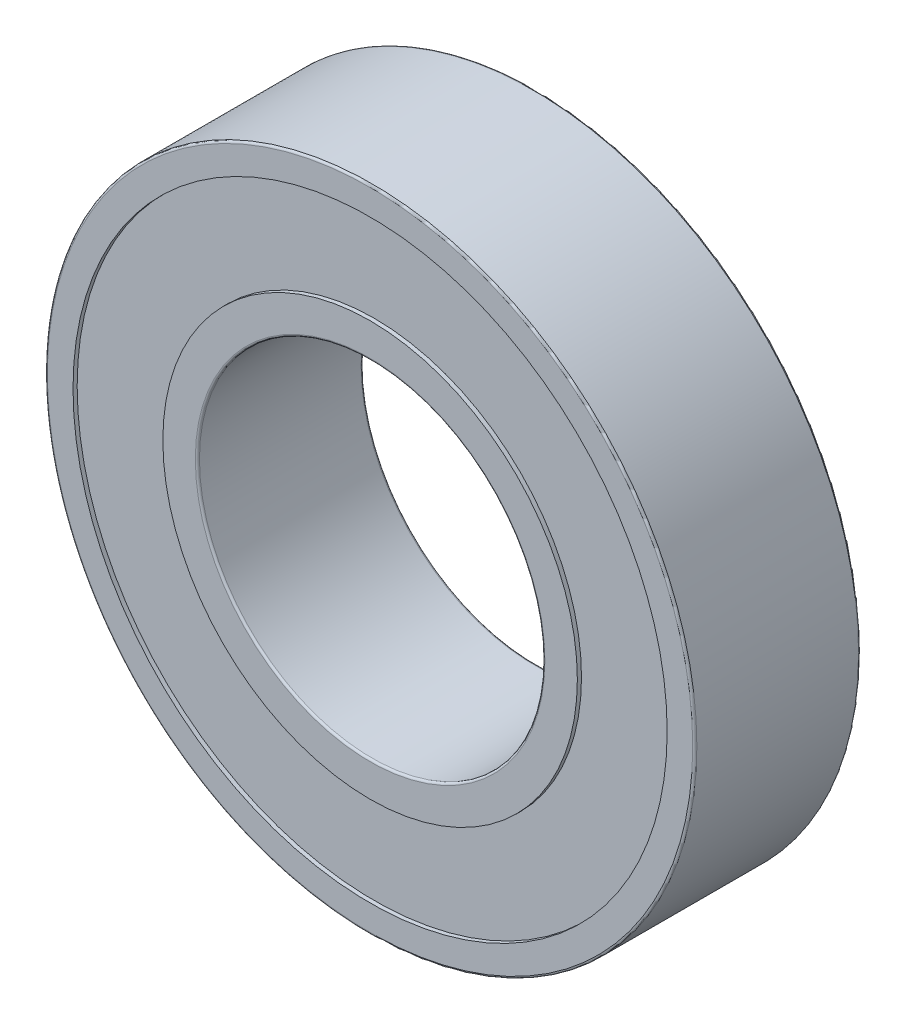
ISO-10303-21;
HEADER;
FILE_DESCRIPTION(('STEP AP214'),'2;1');
FILE_NAME('part.step','',(''),(''),'','','');
FILE_SCHEMA(('AUTOMOTIVE_DESIGN { 1 0 10303 214 1 1 1 1 }'));
ENDSEC;
DATA;
#1=APPLICATION_CONTEXT('core data for automotive mechanical design processes');
#2=APPLICATION_PROTOCOL_DEFINITION('international standard','automotive_design',2000,#1);
#3=PRODUCT_CONTEXT('',#1,'mechanical');
#4=PRODUCT('Part','Part','',(#3));
#5=PRODUCT_RELATED_PRODUCT_CATEGORY('part','',(#4));
#6=PRODUCT_DEFINITION_FORMATION('','',#4);
#7=PRODUCT_DEFINITION_CONTEXT('part definition',#1,'design');
#8=PRODUCT_DEFINITION('design','',#6,#7);
#9=PRODUCT_DEFINITION_SHAPE('','',#8);
#10=(LENGTH_UNIT() NAMED_UNIT(*) SI_UNIT(.MILLI.,.METRE.));
#11=(NAMED_UNIT(*) PLANE_ANGLE_UNIT() SI_UNIT($,.RADIAN.));
#12=(NAMED_UNIT(*) SI_UNIT($,.STERADIAN.) SOLID_ANGLE_UNIT());
#13=UNCERTAINTY_MEASURE_WITH_UNIT(LENGTH_MEASURE(1.E-05),#10,'distance_accuracy_value','');
#14=(GEOMETRIC_REPRESENTATION_CONTEXT(3) GLOBAL_UNCERTAINTY_ASSIGNED_CONTEXT((#13)) GLOBAL_UNIT_ASSIGNED_CONTEXT((#10,
#11,#12)) REPRESENTATION_CONTEXT('',''));
#15=CARTESIAN_POINT('',(0.,0.,0.));
#16=DIRECTION('',(0.,0.,1.));
#17=DIRECTION('',(1.,0.,0.));
#18=AXIS2_PLACEMENT_3D('',#15,#16,#17);
#19=CARTESIAN_POINT('',(0.,0.,0.));
#20=DIRECTION('',(0.,0.,1.));
#21=DIRECTION('',(1.,0.,0.));
#22=AXIS2_PLACEMENT_3D('',#19,#20,#21);
#23=PLANE('',#22);
#24=CARTESIAN_POINT('',(0.,0.,0.));
#25=DIRECTION('',(0.,0.,1.));
#26=DIRECTION('',(1.,0.,0.));
#27=AXIS2_PLACEMENT_3D('',#24,#25,#26);
#28=CIRCLE('',#27,12.65);
#29=CARTESIAN_POINT('',(12.65,0.,0.));
#30=VERTEX_POINT('',#29);
#31=EDGE_CURVE('E64',#30,#30,#28,.T.);
#32=ORIENTED_EDGE('',*,*,#31,.T.);
#33=EDGE_LOOP('',(#32));
#34=FACE_BOUND('',#33,.T.);
#35=CARTESIAN_POINT('',(0.,0.,0.));
#36=DIRECTION('',(0.,0.,1.));
#37=DIRECTION('',(1.,0.,0.));
#38=AXIS2_PLACEMENT_3D('',#35,#36,#37);
#39=CIRCLE('',#38,15.);
#40=CARTESIAN_POINT('',(15.,0.,0.));
#41=VERTEX_POINT('',#40);
#42=EDGE_CURVE('E86',#41,#41,#39,.T.);
#43=ORIENTED_EDGE('',*,*,#42,.F.);
#44=EDGE_LOOP('',(#43));
#45=FACE_BOUND('',#44,.T.);
#46=ADVANCED_FACE('F35',(#34,#45),#23,.F.);
#47=CARTESIAN_POINT('',(0.,0.,12.));
#48=DIRECTION('',(0.,0.,1.));
#49=DIRECTION('',(1.,0.,0.));
#50=AXIS2_PLACEMENT_3D('',#47,#48,#49);
#51=PLANE('',#50);
#52=CARTESIAN_POINT('',(0.,0.,12.));
#53=DIRECTION('',(0.,0.,1.));
#54=DIRECTION('',(1.,0.,0.));
#55=AXIS2_PLACEMENT_3D('',#52,#53,#54);
#56=CIRCLE('',#55,12.65);
#57=CARTESIAN_POINT('',(12.65,0.,12.));
#58=VERTEX_POINT('',#57);
#59=EDGE_CURVE('E42',#58,#58,#56,.F.);
#60=ORIENTED_EDGE('',*,*,#59,.T.);
#61=EDGE_LOOP('',(#60));
#62=FACE_BOUND('',#61,.T.);
#63=CARTESIAN_POINT('',(0.,0.,12.));
#64=DIRECTION('',(0.,0.,1.));
#65=DIRECTION('',(1.,0.,0.));
#66=AXIS2_PLACEMENT_3D('',#63,#64,#65);
#67=CIRCLE('',#66,15.);
#68=CARTESIAN_POINT('',(15.,0.,12.));
#69=VERTEX_POINT('',#68);
#70=EDGE_CURVE('E74',#69,#69,#67,.T.);
#71=ORIENTED_EDGE('',*,*,#70,.T.);
#72=EDGE_LOOP('',(#71));
#73=FACE_BOUND('',#72,.T.);
#74=ADVANCED_FACE('F103',(#62,#73),#51,.T.);
#75=CARTESIAN_POINT('',(0.,0.,12.));
#76=DIRECTION('',(0.,0.,1.));
#77=DIRECTION('',(1.,0.,0.));
#78=AXIS2_PLACEMENT_3D('',#75,#76,#77);
#79=CIRCLE('',#78,23.35);
#80=CARTESIAN_POINT('',(23.35,0.,12.));
#81=VERTEX_POINT('',#80);
#82=EDGE_CURVE('E10',#81,#81,#79,.T.);
#83=ORIENTED_EDGE('',*,*,#82,.T.);
#84=EDGE_LOOP('',(#83));
#85=FACE_BOUND('',#84,.T.);
#86=CARTESIAN_POINT('',(0.,0.,12.));
#87=DIRECTION('',(0.,0.,1.));
#88=DIRECTION('',(1.,0.,0.));
#89=AXIS2_PLACEMENT_3D('',#86,#87,#88);
#90=CIRCLE('',#89,21.5);
#91=CARTESIAN_POINT('',(21.5,0.,12.));
#92=VERTEX_POINT('',#91);
#93=EDGE_CURVE('E68',#92,#92,#90,.T.);
#94=ORIENTED_EDGE('',*,*,#93,.F.);
#95=EDGE_LOOP('',(#94));
#96=FACE_BOUND('',#95,.T.);
#97=ADVANCED_FACE('F110',(#85,#96),#51,.T.);
#98=CARTESIAN_POINT('',(0.,0.,0.));
#99=DIRECTION('',(0.,0.,1.));
#100=DIRECTION('',(1.,0.,0.));
#101=AXIS2_PLACEMENT_3D('',#98,#99,#100);
#102=CIRCLE('',#101,23.35);
#103=CARTESIAN_POINT('',(23.35,0.,0.));
#104=VERTEX_POINT('',#103);
#105=EDGE_CURVE('E46',#104,#104,#102,.F.);
#106=ORIENTED_EDGE('',*,*,#105,.T.);
#107=EDGE_LOOP('',(#106));
#108=FACE_BOUND('',#107,.T.);
#109=CARTESIAN_POINT('',(0.,0.,0.));
#110=DIRECTION('',(0.,0.,1.));
#111=DIRECTION('',(1.,0.,0.));
#112=AXIS2_PLACEMENT_3D('',#109,#110,#111);
#113=CIRCLE('',#112,21.5);
#114=CARTESIAN_POINT('',(21.5,0.,0.));
#115=VERTEX_POINT('',#114);
#116=EDGE_CURVE('E80',#115,#115,#113,.T.);
#117=ORIENTED_EDGE('',*,*,#116,.T.);
#118=EDGE_LOOP('',(#117));
#119=FACE_BOUND('',#118,.T.);
#120=ADVANCED_FACE('F106',(#108,#119),#23,.F.);
#121=CARTESIAN_POINT('',(0.,0.,12.));
#122=DIRECTION('',(0.,0.,-1.));
#123=DIRECTION('',(-1.,0.,0.));
#124=AXIS2_PLACEMENT_3D('',#121,#122,#123);
#125=CYLINDRICAL_SURFACE('',#124,23.5);
#126=CARTESIAN_POINT('',(0.,0.,0.150000000000001));
#127=DIRECTION('',(0.,0.,1.));
#128=DIRECTION('',(1.,0.,0.));
#129=AXIS2_PLACEMENT_3D('',#126,#127,#128);
#130=CIRCLE('',#129,23.5);
#131=CARTESIAN_POINT('',(23.5,0.,0.150000000000001));
#132=VERTEX_POINT('',#131);
#133=EDGE_CURVE('E50',#132,#132,#130,.T.);
#134=ORIENTED_EDGE('',*,*,#133,.T.);
#135=EDGE_LOOP('',(#134));
#136=FACE_BOUND('',#135,.T.);
#137=CARTESIAN_POINT('',(0.,0.,11.85));
#138=DIRECTION('',(0.,0.,1.));
#139=DIRECTION('',(1.,0.,0.));
#140=AXIS2_PLACEMENT_3D('',#137,#138,#139);
#141=CIRCLE('',#140,23.5);
#142=CARTESIAN_POINT('',(23.5,0.,11.85));
#143=VERTEX_POINT('',#142);
#144=EDGE_CURVE('E55',#143,#143,#141,.F.);
#145=ORIENTED_EDGE('',*,*,#144,.T.);
#146=EDGE_LOOP('',(#145));
#147=FACE_BOUND('',#146,.T.);
#148=ADVANCED_FACE('F114',(#136,#147),#125,.T.);
#149=CARTESIAN_POINT('',(0.,0.,12.));
#150=DIRECTION('',(0.,0.,-1.));
#151=DIRECTION('',(-1.,0.,0.));
#152=AXIS2_PLACEMENT_3D('',#149,#150,#151);
#153=CYLINDRICAL_SURFACE('',#152,12.5);
#154=CARTESIAN_POINT('',(0.,0.,0.150000000000001));
#155=DIRECTION('',(0.,0.,1.));
#156=DIRECTION('',(1.,0.,0.));
#157=AXIS2_PLACEMENT_3D('',#154,#155,#156);
#158=CIRCLE('',#157,12.5);
#159=CARTESIAN_POINT('',(12.5,0.,0.150000000000001));
#160=VERTEX_POINT('',#159);
#161=EDGE_CURVE('E58',#160,#160,#158,.F.);
#162=ORIENTED_EDGE('',*,*,#161,.T.);
#163=EDGE_LOOP('',(#162));
#164=FACE_BOUND('',#163,.T.);
#165=CARTESIAN_POINT('',(0.,0.,11.85));
#166=DIRECTION('',(0.,0.,1.));
#167=DIRECTION('',(1.,0.,0.));
#168=AXIS2_PLACEMENT_3D('',#165,#166,#167);
#169=CIRCLE('',#168,12.5);
#170=CARTESIAN_POINT('',(12.5,0.,11.85));
#171=VERTEX_POINT('',#170);
#172=EDGE_CURVE('E61',#171,#171,#169,.T.);
#173=ORIENTED_EDGE('',*,*,#172,.T.);
#174=EDGE_LOOP('',(#173));
#175=FACE_BOUND('',#174,.T.);
#176=ADVANCED_FACE('F120',(#164,#175),#153,.F.);
#177=CARTESIAN_POINT('',(0.,0.,11.7));
#178=DIRECTION('',(0.,0.,1.));
#179=DIRECTION('',(1.,0.,0.));
#180=AXIS2_PLACEMENT_3D('',#177,#178,#179);
#181=CYLINDRICAL_SURFACE('',#180,21.5);
#182=CARTESIAN_POINT('',(0.,0.,11.7));
#183=DIRECTION('',(0.,0.,1.));
#184=DIRECTION('',(1.,0.,0.));
#185=AXIS2_PLACEMENT_3D('',#182,#183,#184);
#186=CIRCLE('',#185,21.5);
#187=CARTESIAN_POINT('',(21.5,0.,11.7));
#188=VERTEX_POINT('',#187);
#189=EDGE_CURVE('E67',#188,#188,#186,.T.);
#190=ORIENTED_EDGE('',*,*,#189,.F.);
#191=EDGE_LOOP('',(#190));
#192=FACE_BOUND('',#191,.T.);
#193=ORIENTED_EDGE('',*,*,#93,.T.);
#194=EDGE_LOOP('',(#193));
#195=FACE_BOUND('',#194,.T.);
#196=ADVANCED_FACE('F142',(#192,#195),#181,.F.);
#197=CARTESIAN_POINT('',(0.,0.,11.7));
#198=DIRECTION('',(0.,0.,1.));
#199=DIRECTION('',(1.,0.,0.));
#200=AXIS2_PLACEMENT_3D('',#197,#198,#199);
#201=PLANE('',#200);
#202=CARTESIAN_POINT('',(0.,0.,11.7));
#203=DIRECTION('',(0.,0.,1.));
#204=DIRECTION('',(1.,0.,0.));
#205=AXIS2_PLACEMENT_3D('',#202,#203,#204);
#206=CIRCLE('',#205,15.);
#207=CARTESIAN_POINT('',(15.,0.,11.7));
#208=VERTEX_POINT('',#207);
#209=EDGE_CURVE('E71',#208,#208,#206,.T.);
#210=ORIENTED_EDGE('',*,*,#209,.F.);
#211=EDGE_LOOP('',(#210));
#212=FACE_BOUND('',#211,.T.);
#213=ORIENTED_EDGE('',*,*,#189,.T.);
#214=EDGE_LOOP('',(#213));
#215=FACE_BOUND('',#214,.T.);
#216=ADVANCED_FACE('F138',(#212,#215),#201,.T.);
#217=CARTESIAN_POINT('',(0.,0.,11.7));
#218=DIRECTION('',(0.,0.,1.));
#219=DIRECTION('',(1.,0.,0.));
#220=AXIS2_PLACEMENT_3D('',#217,#218,#219);
#221=CYLINDRICAL_SURFACE('',#220,15.);
#222=ORIENTED_EDGE('',*,*,#209,.T.);
#223=EDGE_LOOP('',(#222));
#224=FACE_BOUND('',#223,.T.);
#225=ORIENTED_EDGE('',*,*,#70,.F.);
#226=EDGE_LOOP('',(#225));
#227=FACE_BOUND('',#226,.T.);
#228=ADVANCED_FACE('F132',(#224,#227),#221,.T.);
#229=CARTESIAN_POINT('',(0.,0.,0.5));
#230=DIRECTION('',(0.,0.,1.));
#231=DIRECTION('',(1.,0.,0.));
#232=AXIS2_PLACEMENT_3D('',#229,#230,#231);
#233=PLANE('',#232);
#234=CARTESIAN_POINT('',(0.,0.,0.5));
#235=DIRECTION('',(0.,0.,1.));
#236=DIRECTION('',(1.,0.,0.));
#237=AXIS2_PLACEMENT_3D('',#234,#235,#236);
#238=CIRCLE('',#237,21.5);
#239=CARTESIAN_POINT('',(21.5,0.,0.5));
#240=VERTEX_POINT('',#239);
#241=EDGE_CURVE('E77',#240,#240,#238,.T.);
#242=ORIENTED_EDGE('',*,*,#241,.F.);
#243=EDGE_LOOP('',(#242));
#244=FACE_BOUND('',#243,.T.);
#245=CARTESIAN_POINT('',(0.,0.,0.5));
#246=DIRECTION('',(0.,0.,1.));
#247=DIRECTION('',(1.,0.,0.));
#248=AXIS2_PLACEMENT_3D('',#245,#246,#247);
#249=CIRCLE('',#248,15.);
#250=CARTESIAN_POINT('',(15.,0.,0.5));
#251=VERTEX_POINT('',#250);
#252=EDGE_CURVE('E83',#251,#251,#249,.T.);
#253=ORIENTED_EDGE('',*,*,#252,.T.);
#254=EDGE_LOOP('',(#253));
#255=FACE_BOUND('',#254,.T.);
#256=ADVANCED_FACE('F92',(#244,#255),#233,.F.);
#257=CARTESIAN_POINT('',(0.,0.,0.5));
#258=DIRECTION('',(0.,0.,-1.));
#259=DIRECTION('',(-1.,0.,0.));
#260=AXIS2_PLACEMENT_3D('',#257,#258,#259);
#261=CYLINDRICAL_SURFACE('',#260,21.5);
#262=ORIENTED_EDGE('',*,*,#241,.T.);
#263=EDGE_LOOP('',(#262));
#264=FACE_BOUND('',#263,.T.);
#265=ORIENTED_EDGE('',*,*,#116,.F.);
#266=EDGE_LOOP('',(#265));
#267=FACE_BOUND('',#266,.T.);
#268=ADVANCED_FACE('F98',(#264,#267),#261,.F.);
#269=CARTESIAN_POINT('',(0.,0.,0.5));
#270=DIRECTION('',(0.,0.,-1.));
#271=DIRECTION('',(-1.,0.,0.));
#272=AXIS2_PLACEMENT_3D('',#269,#270,#271);
#273=CYLINDRICAL_SURFACE('',#272,15.);
#274=ORIENTED_EDGE('',*,*,#252,.F.);
#275=EDGE_LOOP('',(#274));
#276=FACE_BOUND('',#275,.T.);
#277=ORIENTED_EDGE('',*,*,#42,.T.);
#278=EDGE_LOOP('',(#277));
#279=FACE_BOUND('',#278,.T.);
#280=ADVANCED_FACE('F94',(#276,#279),#273,.T.);
#281=CARTESIAN_POINT('',(0.,0.,0.150000000000001));
#282=DIRECTION('',(0.,0.,1.));
#283=DIRECTION('',(1.,0.,0.));
#284=AXIS2_PLACEMENT_3D('',#281,#282,#283);
#285=TOROIDAL_SURFACE('',#284,12.65,0.15);
#286=ORIENTED_EDGE('',*,*,#161,.F.);
#287=EDGE_LOOP('',(#286));
#288=FACE_BOUND('',#287,.T.);
#289=ORIENTED_EDGE('',*,*,#31,.F.);
#290=EDGE_LOOP('',(#289));
#291=FACE_BOUND('',#290,.T.);
#292=ADVANCED_FACE('F97',(#288,#291),#285,.T.);
#293=CARTESIAN_POINT('',(0.,0.,0.150000000000001));
#294=DIRECTION('',(0.,0.,1.));
#295=DIRECTION('',(1.,0.,0.));
#296=AXIS2_PLACEMENT_3D('',#293,#294,#295);
#297=TOROIDAL_SURFACE('',#296,23.35,0.15);
#298=ORIENTED_EDGE('',*,*,#105,.F.);
#299=EDGE_LOOP('',(#298));
#300=FACE_BOUND('',#299,.T.);
#301=ORIENTED_EDGE('',*,*,#133,.F.);
#302=EDGE_LOOP('',(#301));
#303=FACE_BOUND('',#302,.T.);
#304=ADVANCED_FACE('F157',(#300,#303),#297,.T.);
#305=CARTESIAN_POINT('',(0.,0.,11.85));
#306=DIRECTION('',(0.,0.,1.));
#307=DIRECTION('',(1.,0.,0.));
#308=AXIS2_PLACEMENT_3D('',#305,#306,#307);
#309=TOROIDAL_SURFACE('',#308,12.65,0.15);
#310=ORIENTED_EDGE('',*,*,#59,.F.);
#311=EDGE_LOOP('',(#310));
#312=FACE_BOUND('',#311,.T.);
#313=ORIENTED_EDGE('',*,*,#172,.F.);
#314=EDGE_LOOP('',(#313));
#315=FACE_BOUND('',#314,.T.);
#316=ADVANCED_FACE('F155',(#312,#315),#309,.T.);
#317=CARTESIAN_POINT('',(0.,0.,11.85));
#318=DIRECTION('',(0.,0.,1.));
#319=DIRECTION('',(1.,0.,0.));
#320=AXIS2_PLACEMENT_3D('',#317,#318,#319);
#321=TOROIDAL_SURFACE('',#320,23.35,0.15);
#322=ORIENTED_EDGE('',*,*,#144,.F.);
#323=EDGE_LOOP('',(#322));
#324=FACE_BOUND('',#323,.T.);
#325=ORIENTED_EDGE('',*,*,#82,.F.);
#326=EDGE_LOOP('',(#325));
#327=FACE_BOUND('',#326,.T.);
#328=ADVANCED_FACE('F37',(#324,#327),#321,.T.);
#329=CLOSED_SHELL('',(#46,#74,#97,#120,#148,#176,#196,#216,#228,#256,#268,#280,#292,#304,#316,#328));
#330=MANIFOLD_SOLID_BREP('B2',#329);
#331=ADVANCED_BREP_SHAPE_REPRESENTATION('',(#18,#330),#14);
#332=SHAPE_DEFINITION_REPRESENTATION(#9,#331);
ENDSEC;
END-ISO-10303-21;
